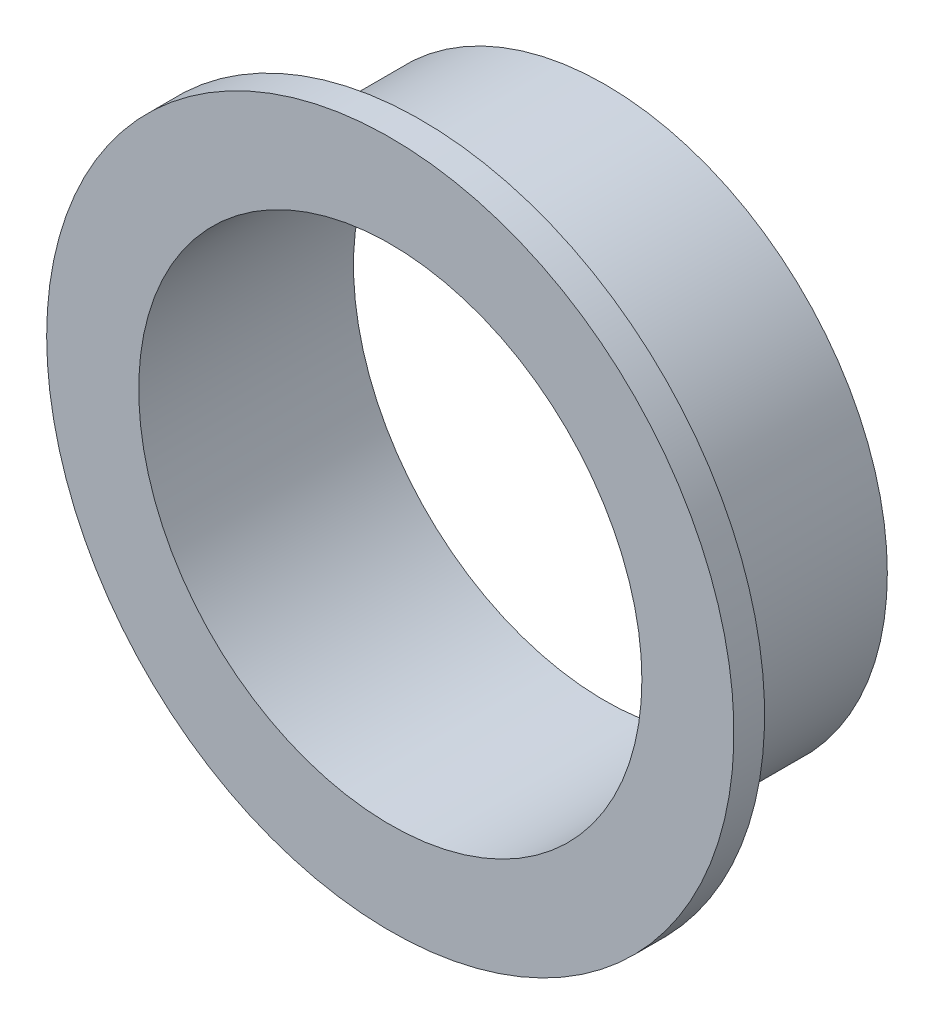
ISO-10303-21;
HEADER;
FILE_DESCRIPTION(('STEP AP214'),'2;1');
FILE_NAME('part.step','',(''),(''),'','','');
FILE_SCHEMA(('AUTOMOTIVE_DESIGN { 1 0 10303 214 1 1 1 1 }'));
ENDSEC;
DATA;
#1=APPLICATION_CONTEXT('core data for automotive mechanical design processes');
#2=APPLICATION_PROTOCOL_DEFINITION('international standard','automotive_design',2000,#1);
#3=PRODUCT_CONTEXT('',#1,'mechanical');
#4=PRODUCT('Part','Part','',(#3));
#5=PRODUCT_RELATED_PRODUCT_CATEGORY('part','',(#4));
#6=PRODUCT_DEFINITION_FORMATION('','',#4);
#7=PRODUCT_DEFINITION_CONTEXT('part definition',#1,'design');
#8=PRODUCT_DEFINITION('design','',#6,#7);
#9=PRODUCT_DEFINITION_SHAPE('','',#8);
#10=(LENGTH_UNIT() NAMED_UNIT(*) SI_UNIT(.MILLI.,.METRE.));
#11=(NAMED_UNIT(*) PLANE_ANGLE_UNIT() SI_UNIT($,.RADIAN.));
#12=(NAMED_UNIT(*) SI_UNIT($,.STERADIAN.) SOLID_ANGLE_UNIT());
#13=UNCERTAINTY_MEASURE_WITH_UNIT(LENGTH_MEASURE(1.E-05),#10,'distance_accuracy_value','');
#14=(GEOMETRIC_REPRESENTATION_CONTEXT(3) GLOBAL_UNCERTAINTY_ASSIGNED_CONTEXT((#13)) GLOBAL_UNIT_ASSIGNED_CONTEXT((#10,
#11,#12)) REPRESENTATION_CONTEXT('',''));
#15=CARTESIAN_POINT('',(0.,0.,0.));
#16=DIRECTION('',(0.,0.,1.));
#17=DIRECTION('',(1.,0.,0.));
#18=AXIS2_PLACEMENT_3D('',#15,#16,#17);
#19=CARTESIAN_POINT('',(-35.56,0.,0.));
#20=DIRECTION('',(0.,0.,1.));
#21=DIRECTION('',(1.,0.,0.));
#22=AXIS2_PLACEMENT_3D('',#19,#20,#21);
#23=PLANE('',#22);
#24=CARTESIAN_POINT('',(-35.56,0.,0.));
#25=DIRECTION('',(0.,0.,-1.));
#26=DIRECTION('',(-1.,0.,0.));
#27=AXIS2_PLACEMENT_3D('',#24,#25,#26);
#28=CIRCLE('',#27,26.035);
#29=CARTESIAN_POINT('',(-9.525,0.,0.));
#30=VERTEX_POINT('',#29);
#31=EDGE_CURVE('E87',#30,#30,#28,.T.);
#32=ORIENTED_EDGE('',*,*,#31,.F.);
#33=EDGE_LOOP('',(#32));
#34=FACE_BOUND('',#33,.T.);
#35=CARTESIAN_POINT('',(-35.56,0.,0.));
#36=DIRECTION('',(0.,0.,1.));
#37=DIRECTION('',(1.,0.,0.));
#38=AXIS2_PLACEMENT_3D('',#35,#36,#37);
#39=CIRCLE('',#38,29.21);
#40=CARTESIAN_POINT('',(-64.77,0.,0.));
#41=VERTEX_POINT('',#40);
#42=EDGE_CURVE('E11',#41,#41,#39,.T.);
#43=ORIENTED_EDGE('',*,*,#42,.F.);
#44=EDGE_LOOP('',(#43));
#45=FACE_BOUND('',#44,.T.);
#46=ADVANCED_FACE('F16',(#34,#45),#23,.F.);
#47=CARTESIAN_POINT('',(-35.56,0.,0.));
#48=DIRECTION('',(0.,0.,1.));
#49=DIRECTION('',(1.,0.,0.));
#50=AXIS2_PLACEMENT_3D('',#47,#48,#49);
#51=CYLINDRICAL_SURFACE('',#50,29.21);
#52=CARTESIAN_POINT('',(-35.56,0.,19.05));
#53=DIRECTION('',(0.,0.,1.));
#54=DIRECTION('',(1.,0.,0.));
#55=AXIS2_PLACEMENT_3D('',#52,#53,#54);
#56=CIRCLE('',#55,29.21);
#57=CARTESIAN_POINT('',(-64.77,0.,19.05));
#58=VERTEX_POINT('',#57);
#59=EDGE_CURVE('E73',#58,#58,#56,.T.);
#60=ORIENTED_EDGE('',*,*,#59,.F.);
#61=DIRECTION('',(0.,0.,-1.));
#62=VECTOR('',#61,1.);
#63=CARTESIAN_POINT('',(-64.77,0.,0.));
#64=LINE('',#63,#62);
#65=EDGE_CURVE('E27',#58,#41,#64,.T.);
#66=ORIENTED_EDGE('',*,*,#65,.T.);
#67=ORIENTED_EDGE('',*,*,#42,.T.);
#68=ORIENTED_EDGE('',*,*,#65,.F.);
#69=EDGE_LOOP('',(#60,#66,#67,#68));
#70=FACE_BOUND('',#69,.T.);
#71=ADVANCED_FACE('F105',(#70),#51,.T.);
#72=CARTESIAN_POINT('',(-35.56,0.,0.));
#73=DIRECTION('',(0.,0.,1.));
#74=DIRECTION('',(-1.,0.,0.));
#75=AXIS2_PLACEMENT_3D('',#72,#73,#74);
#76=CYLINDRICAL_SURFACE('',#75,26.035);
#77=CARTESIAN_POINT('',(-35.56,0.,22.225));
#78=DIRECTION('',(0.,0.,-1.));
#79=DIRECTION('',(-1.,0.,0.));
#80=AXIS2_PLACEMENT_3D('',#77,#78,#79);
#81=CIRCLE('',#80,26.035);
#82=CARTESIAN_POINT('',(-9.525,0.,22.225));
#83=VERTEX_POINT('',#82);
#84=EDGE_CURVE('E69',#83,#83,#81,.T.);
#85=ORIENTED_EDGE('',*,*,#84,.F.);
#86=DIRECTION('',(0.,0.,-1.));
#87=VECTOR('',#86,1.);
#88=CARTESIAN_POINT('',(-9.525,0.,0.));
#89=LINE('',#88,#87);
#90=EDGE_CURVE('E20',#83,#30,#89,.T.);
#91=ORIENTED_EDGE('',*,*,#90,.T.);
#92=ORIENTED_EDGE('',*,*,#31,.T.);
#93=ORIENTED_EDGE('',*,*,#90,.F.);
#94=EDGE_LOOP('',(#85,#91,#92,#93));
#95=FACE_BOUND('',#94,.T.);
#96=ADVANCED_FACE('F18',(#95),#76,.F.);
#97=CARTESIAN_POINT('',(-35.56,0.,22.225));
#98=DIRECTION('',(0.,0.,1.));
#99=DIRECTION('',(1.,0.,0.));
#100=AXIS2_PLACEMENT_3D('',#97,#98,#99);
#101=PLANE('',#100);
#102=ORIENTED_EDGE('',*,*,#84,.T.);
#103=EDGE_LOOP('',(#102));
#104=FACE_BOUND('',#103,.T.);
#105=CARTESIAN_POINT('',(-35.56,0.,22.225));
#106=DIRECTION('',(0.,0.,1.));
#107=DIRECTION('',(1.,0.,0.));
#108=AXIS2_PLACEMENT_3D('',#105,#106,#107);
#109=CIRCLE('',#108,35.56);
#110=CARTESIAN_POINT('',(-71.12,0.,22.225));
#111=VERTEX_POINT('',#110);
#112=EDGE_CURVE('E65',#111,#111,#109,.T.);
#113=ORIENTED_EDGE('',*,*,#112,.T.);
#114=EDGE_LOOP('',(#113));
#115=FACE_BOUND('',#114,.T.);
#116=ADVANCED_FACE('F71',(#104,#115),#101,.T.);
#117=CARTESIAN_POINT('',(-35.56,0.,19.05));
#118=DIRECTION('',(0.,0.,1.));
#119=DIRECTION('',(1.,0.,0.));
#120=AXIS2_PLACEMENT_3D('',#117,#118,#119);
#121=CYLINDRICAL_SURFACE('',#120,35.56);
#122=ORIENTED_EDGE('',*,*,#112,.F.);
#123=DIRECTION('',(0.,0.,-1.));
#124=VECTOR('',#123,1.);
#125=CARTESIAN_POINT('',(-71.12,0.,19.05));
#126=LINE('',#125,#124);
#127=CARTESIAN_POINT('',(-71.12,0.,19.05));
#128=VERTEX_POINT('',#127);
#129=EDGE_CURVE('E56',#111,#128,#126,.T.);
#130=ORIENTED_EDGE('',*,*,#129,.T.);
#131=CARTESIAN_POINT('',(-35.56,0.,19.05));
#132=DIRECTION('',(0.,0.,1.));
#133=DIRECTION('',(1.,0.,0.));
#134=AXIS2_PLACEMENT_3D('',#131,#132,#133);
#135=CIRCLE('',#134,35.56);
#136=EDGE_CURVE('E67',#128,#128,#135,.T.);
#137=ORIENTED_EDGE('',*,*,#136,.T.);
#138=ORIENTED_EDGE('',*,*,#129,.F.);
#139=EDGE_LOOP('',(#122,#130,#137,#138));
#140=FACE_BOUND('',#139,.T.);
#141=ADVANCED_FACE('F64',(#140),#121,.T.);
#142=CARTESIAN_POINT('',(-35.56,0.,19.05));
#143=DIRECTION('',(0.,0.,1.));
#144=DIRECTION('',(1.,0.,0.));
#145=AXIS2_PLACEMENT_3D('',#142,#143,#144);
#146=PLANE('',#145);
#147=ORIENTED_EDGE('',*,*,#59,.T.);
#148=EDGE_LOOP('',(#147));
#149=FACE_BOUND('',#148,.T.);
#150=ORIENTED_EDGE('',*,*,#136,.F.);
#151=EDGE_LOOP('',(#150));
#152=FACE_BOUND('',#151,.T.);
#153=ADVANCED_FACE('F104',(#149,#152),#146,.F.);
#154=CLOSED_SHELL('',(#46,#71,#96,#116,#141,#153));
#155=MANIFOLD_SOLID_BREP('B1',#154);
#156=ADVANCED_BREP_SHAPE_REPRESENTATION('',(#18,#155),#14);
#157=SHAPE_DEFINITION_REPRESENTATION(#9,#156);
ENDSEC;
END-ISO-10303-21;
